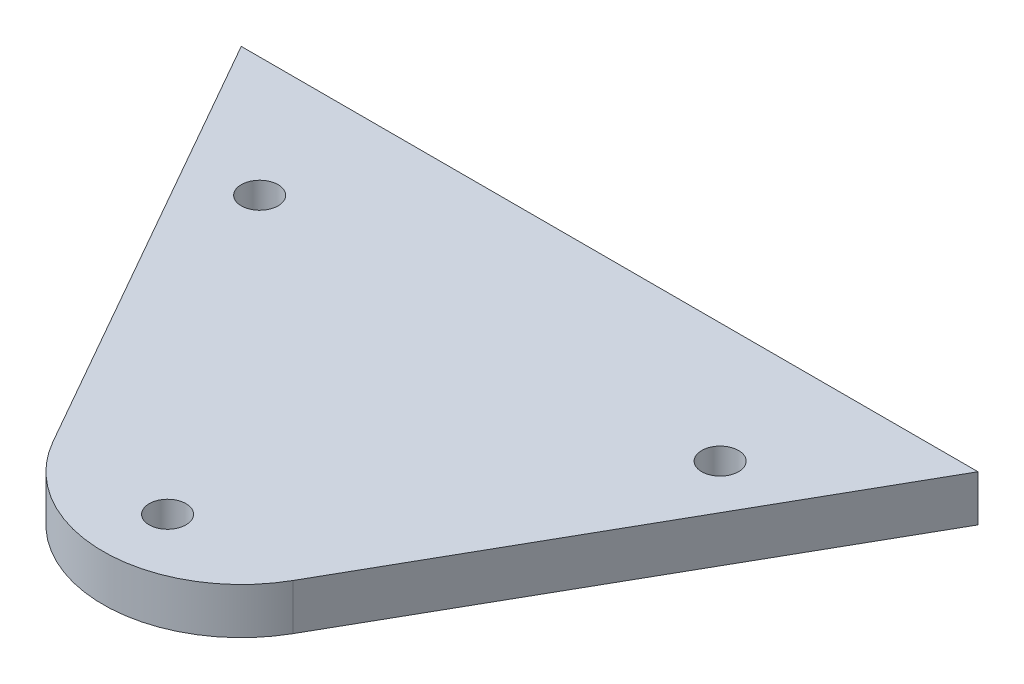
ISO-10303-21;
HEADER;
FILE_DESCRIPTION(('STEP AP214'),'2;1');
FILE_NAME('part.step','',(''),(''),'','','');
FILE_SCHEMA(('AUTOMOTIVE_DESIGN { 1 0 10303 214 1 1 1 1 }'));
ENDSEC;
DATA;
#1=APPLICATION_CONTEXT('core data for automotive mechanical design processes');
#2=APPLICATION_PROTOCOL_DEFINITION('international standard','automotive_design',2000,#1);
#3=PRODUCT_CONTEXT('',#1,'mechanical');
#4=PRODUCT('Part','Part','',(#3));
#5=PRODUCT_RELATED_PRODUCT_CATEGORY('part','',(#4));
#6=PRODUCT_DEFINITION_FORMATION('','',#4);
#7=PRODUCT_DEFINITION_CONTEXT('part definition',#1,'design');
#8=PRODUCT_DEFINITION('design','',#6,#7);
#9=PRODUCT_DEFINITION_SHAPE('','',#8);
#10=(LENGTH_UNIT() NAMED_UNIT(*) SI_UNIT(.MILLI.,.METRE.));
#11=(NAMED_UNIT(*) PLANE_ANGLE_UNIT() SI_UNIT($,.RADIAN.));
#12=(NAMED_UNIT(*) SI_UNIT($,.STERADIAN.) SOLID_ANGLE_UNIT());
#13=UNCERTAINTY_MEASURE_WITH_UNIT(LENGTH_MEASURE(1.E-05),#10,'distance_accuracy_value','');
#14=(GEOMETRIC_REPRESENTATION_CONTEXT(3) GLOBAL_UNCERTAINTY_ASSIGNED_CONTEXT((#13)) GLOBAL_UNIT_ASSIGNED_CONTEXT((#10,
#11,#12)) REPRESENTATION_CONTEXT('',''));
#15=CARTESIAN_POINT('',(0.,0.,0.));
#16=DIRECTION('',(0.,0.,1.));
#17=DIRECTION('',(1.,0.,0.));
#18=AXIS2_PLACEMENT_3D('',#15,#16,#17);
#19=CARTESIAN_POINT('',(-40.,5.,-48.));
#20=DIRECTION('',(0.869294507164732,0.,-0.494294507164732));
#21=DIRECTION('',(-0.494294507164732,0.,-0.869294507164732));
#22=AXIS2_PLACEMENT_3D('',#19,#20,#21);
#23=PLANE('',#22);
#24=DIRECTION('',(0.494294507164732,0.,0.869294507164732));
#25=VECTOR('',#24,1.);
#26=CARTESIAN_POINT('',(-40.,0.,-48.));
#27=LINE('',#26,#25);
#28=CARTESIAN_POINT('',(-40.,0.,-48.));
#29=VERTEX_POINT('',#28);
#30=CARTESIAN_POINT('',(-13.039417607471,0.,-0.585582392529021));
#31=VERTEX_POINT('',#30);
#32=EDGE_CURVE('E107',#29,#31,#27,.T.);
#33=ORIENTED_EDGE('',*,*,#32,.T.);
#34=DIRECTION('',(0.,-1.,0.));
#35=VECTOR('',#34,1.);
#36=CARTESIAN_POINT('',(-13.039417607471,5.,-0.585582392529021));
#37=LINE('',#36,#35);
#38=CARTESIAN_POINT('',(-13.039417607471,5.,-0.585582392529021));
#39=VERTEX_POINT('',#38);
#40=EDGE_CURVE('E11',#39,#31,#37,.T.);
#41=ORIENTED_EDGE('',*,*,#40,.F.);
#42=DIRECTION('',(0.494294507164732,0.,0.869294507164732));
#43=VECTOR('',#42,1.);
#44=CARTESIAN_POINT('',(-40.,5.,-48.));
#45=LINE('',#44,#43);
#46=CARTESIAN_POINT('',(-40.,5.,-48.));
#47=VERTEX_POINT('',#46);
#48=EDGE_CURVE('E91',#47,#39,#45,.T.);
#49=ORIENTED_EDGE('',*,*,#48,.F.);
#50=DIRECTION('',(0.,-1.,0.));
#51=VECTOR('',#50,1.);
#52=CARTESIAN_POINT('',(-40.,5.,-48.));
#53=LINE('',#52,#51);
#54=EDGE_CURVE('E103',#47,#29,#53,.T.);
#55=ORIENTED_EDGE('',*,*,#54,.T.);
#56=EDGE_LOOP('',(#33,#41,#49,#55));
#57=FACE_BOUND('',#56,.T.);
#58=ADVANCED_FACE('F39',(#57),#23,.F.);
#59=CARTESIAN_POINT('',(0.,5.,-8.));
#60=DIRECTION('',(0.,-1.,0.));
#61=DIRECTION('',(0.,0.,-1.));
#62=AXIS2_PLACEMENT_3D('',#59,#60,#61);
#63=CYLINDRICAL_SURFACE('',#62,15.);
#64=CARTESIAN_POINT('',(0.,0.,-8.));
#65=DIRECTION('',(0.,1.,0.));
#66=DIRECTION('',(0.,0.,1.));
#67=AXIS2_PLACEMENT_3D('',#64,#65,#66);
#68=CIRCLE('',#67,15.);
#69=CARTESIAN_POINT('',(13.039417607471,0.,-0.585582392529017));
#70=VERTEX_POINT('',#69);
#71=EDGE_CURVE('E96',#31,#70,#68,.T.);
#72=ORIENTED_EDGE('',*,*,#71,.T.);
#73=DIRECTION('',(0.,-1.,0.));
#74=VECTOR('',#73,1.);
#75=CARTESIAN_POINT('',(13.039417607471,5.,-0.585582392529017));
#76=LINE('',#75,#74);
#77=CARTESIAN_POINT('',(13.039417607471,5.,-0.585582392529017));
#78=VERTEX_POINT('',#77);
#79=EDGE_CURVE('E48',#78,#70,#76,.T.);
#80=ORIENTED_EDGE('',*,*,#79,.F.);
#81=CARTESIAN_POINT('',(0.,5.,-8.));
#82=DIRECTION('',(0.,1.,0.));
#83=DIRECTION('',(0.,0.,1.));
#84=AXIS2_PLACEMENT_3D('',#81,#82,#83);
#85=CIRCLE('',#84,15.);
#86=EDGE_CURVE('E86',#39,#78,#85,.T.);
#87=ORIENTED_EDGE('',*,*,#86,.F.);
#88=ORIENTED_EDGE('',*,*,#40,.T.);
#89=EDGE_LOOP('',(#72,#80,#87,#88));
#90=FACE_BOUND('',#89,.T.);
#91=ADVANCED_FACE('F95',(#90),#63,.T.);
#92=CARTESIAN_POINT('',(13.039417607471,5.,-0.585582392529017));
#93=DIRECTION('',(-0.869294507164732,0.,-0.494294507164732));
#94=DIRECTION('',(-0.494294507164732,0.,0.869294507164732));
#95=AXIS2_PLACEMENT_3D('',#92,#93,#94);
#96=PLANE('',#95);
#97=DIRECTION('',(0.494294507164732,0.,-0.869294507164732));
#98=VECTOR('',#97,1.);
#99=CARTESIAN_POINT('',(13.039417607471,0.,-0.585582392529017));
#100=LINE('',#99,#98);
#101=CARTESIAN_POINT('',(40.,0.,-48.));
#102=VERTEX_POINT('',#101);
#103=EDGE_CURVE('E73',#70,#102,#100,.T.);
#104=ORIENTED_EDGE('',*,*,#103,.T.);
#105=DIRECTION('',(0.,-1.,0.));
#106=VECTOR('',#105,1.);
#107=CARTESIAN_POINT('',(40.,5.,-48.));
#108=LINE('',#107,#106);
#109=CARTESIAN_POINT('',(40.,5.,-48.));
#110=VERTEX_POINT('',#109);
#111=EDGE_CURVE('E98',#110,#102,#108,.T.);
#112=ORIENTED_EDGE('',*,*,#111,.F.);
#113=DIRECTION('',(0.494294507164732,0.,-0.869294507164732));
#114=VECTOR('',#113,1.);
#115=CARTESIAN_POINT('',(13.039417607471,5.,-0.585582392529017));
#116=LINE('',#115,#114);
#117=EDGE_CURVE('E89',#78,#110,#116,.T.);
#118=ORIENTED_EDGE('',*,*,#117,.F.);
#119=ORIENTED_EDGE('',*,*,#79,.T.);
#120=EDGE_LOOP('',(#104,#112,#118,#119));
#121=FACE_BOUND('',#120,.T.);
#122=ADVANCED_FACE('F99',(#121),#96,.F.);
#123=CARTESIAN_POINT('',(40.,5.,-48.));
#124=DIRECTION('',(0.,0.,1.));
#125=DIRECTION('',(1.,0.,0.));
#126=AXIS2_PLACEMENT_3D('',#123,#124,#125);
#127=PLANE('',#126);
#128=DIRECTION('',(-1.,0.,0.));
#129=VECTOR('',#128,1.);
#130=CARTESIAN_POINT('',(40.,0.,-48.));
#131=LINE('',#130,#129);
#132=EDGE_CURVE('E79',#102,#29,#131,.T.);
#133=ORIENTED_EDGE('',*,*,#132,.T.);
#134=ORIENTED_EDGE('',*,*,#54,.F.);
#135=DIRECTION('',(-1.,0.,0.));
#136=VECTOR('',#135,1.);
#137=CARTESIAN_POINT('',(40.,5.,-48.));
#138=LINE('',#137,#136);
#139=EDGE_CURVE('E56',#110,#47,#138,.T.);
#140=ORIENTED_EDGE('',*,*,#139,.F.);
#141=ORIENTED_EDGE('',*,*,#111,.T.);
#142=EDGE_LOOP('',(#133,#134,#140,#141));
#143=FACE_BOUND('',#142,.T.);
#144=ADVANCED_FACE('F121',(#143),#127,.F.);
#145=CARTESIAN_POINT('',(0.,5.,-8.));
#146=DIRECTION('',(0.,1.,0.));
#147=DIRECTION('',(0.,0.,1.));
#148=AXIS2_PLACEMENT_3D('',#145,#146,#147);
#149=PLANE('',#148);
#150=CARTESIAN_POINT('',(0.,5.,0.));
#151=DIRECTION('',(0.,1.,0.));
#152=DIRECTION('',(0.,0.,1.));
#153=AXIS2_PLACEMENT_3D('',#150,#151,#152);
#154=CIRCLE('',#153,2.);
#155=CARTESIAN_POINT('',(0.,5.,2.));
#156=VERTEX_POINT('',#155);
#157=EDGE_CURVE('E147',#156,#156,#154,.T.);
#158=ORIENTED_EDGE('',*,*,#157,.F.);
#159=EDGE_LOOP('',(#158));
#160=FACE_BOUND('',#159,.T.);
#161=CARTESIAN_POINT('',(25.,5.,-35.));
#162=DIRECTION('',(0.,-1.,0.));
#163=DIRECTION('',(0.,0.,1.));
#164=AXIS2_PLACEMENT_3D('',#161,#162,#163);
#165=CIRCLE('',#164,2.);
#166=CARTESIAN_POINT('',(25.,5.,-33.));
#167=VERTEX_POINT('',#166);
#168=EDGE_CURVE('E135',#167,#167,#165,.T.);
#169=ORIENTED_EDGE('',*,*,#168,.T.);
#170=EDGE_LOOP('',(#169));
#171=FACE_BOUND('',#170,.T.);
#172=CARTESIAN_POINT('',(-25.,5.,-35.));
#173=DIRECTION('',(0.,1.,0.));
#174=DIRECTION('',(0.,0.,1.));
#175=AXIS2_PLACEMENT_3D('',#172,#173,#174);
#176=CIRCLE('',#175,2.);
#177=CARTESIAN_POINT('',(-25.,5.,-33.));
#178=VERTEX_POINT('',#177);
#179=EDGE_CURVE('E131',#178,#178,#176,.T.);
#180=ORIENTED_EDGE('',*,*,#179,.F.);
#181=EDGE_LOOP('',(#180));
#182=FACE_BOUND('',#181,.T.);
#183=ORIENTED_EDGE('',*,*,#48,.T.);
#184=ORIENTED_EDGE('',*,*,#86,.T.);
#185=ORIENTED_EDGE('',*,*,#117,.T.);
#186=ORIENTED_EDGE('',*,*,#139,.T.);
#187=EDGE_LOOP('',(#183,#184,#185,#186));
#188=FACE_BOUND('',#187,.T.);
#189=ADVANCED_FACE('F87',(#160,#171,#182,#188),#149,.T.);
#190=CARTESIAN_POINT('',(0.,0.,-8.));
#191=DIRECTION('',(0.,1.,0.));
#192=DIRECTION('',(0.,0.,1.));
#193=AXIS2_PLACEMENT_3D('',#190,#191,#192);
#194=PLANE('',#193);
#195=CARTESIAN_POINT('',(0.,0.,0.));
#196=DIRECTION('',(0.,1.,0.));
#197=DIRECTION('',(0.,0.,1.));
#198=AXIS2_PLACEMENT_3D('',#195,#196,#197);
#199=CIRCLE('',#198,2.);
#200=CARTESIAN_POINT('',(0.,0.,2.));
#201=VERTEX_POINT('',#200);
#202=EDGE_CURVE('E140',#201,#201,#199,.F.);
#203=ORIENTED_EDGE('',*,*,#202,.F.);
#204=EDGE_LOOP('',(#203));
#205=FACE_BOUND('',#204,.T.);
#206=CARTESIAN_POINT('',(25.,0.,-35.));
#207=DIRECTION('',(0.,1.,0.));
#208=DIRECTION('',(0.,0.,1.));
#209=AXIS2_PLACEMENT_3D('',#206,#207,#208);
#210=CIRCLE('',#209,2.);
#211=CARTESIAN_POINT('',(25.,0.,-33.));
#212=VERTEX_POINT('',#211);
#213=EDGE_CURVE('E136',#212,#212,#210,.T.);
#214=ORIENTED_EDGE('',*,*,#213,.T.);
#215=EDGE_LOOP('',(#214));
#216=FACE_BOUND('',#215,.T.);
#217=CARTESIAN_POINT('',(-25.,0.,-35.));
#218=DIRECTION('',(0.,1.,0.));
#219=DIRECTION('',(0.,0.,1.));
#220=AXIS2_PLACEMENT_3D('',#217,#218,#219);
#221=CIRCLE('',#220,2.);
#222=CARTESIAN_POINT('',(-25.,0.,-33.));
#223=VERTEX_POINT('',#222);
#224=EDGE_CURVE('E111',#223,#223,#221,.F.);
#225=ORIENTED_EDGE('',*,*,#224,.F.);
#226=EDGE_LOOP('',(#225));
#227=FACE_BOUND('',#226,.T.);
#228=ORIENTED_EDGE('',*,*,#32,.F.);
#229=ORIENTED_EDGE('',*,*,#132,.F.);
#230=ORIENTED_EDGE('',*,*,#103,.F.);
#231=ORIENTED_EDGE('',*,*,#71,.F.);
#232=EDGE_LOOP('',(#228,#229,#230,#231));
#233=FACE_BOUND('',#232,.T.);
#234=ADVANCED_FACE('F124',(#205,#216,#227,#233),#194,.F.);
#235=CARTESIAN_POINT('',(-25.,-0.00100000000000013,-35.));
#236=DIRECTION('',(0.,1.,0.));
#237=DIRECTION('',(0.,0.,1.));
#238=AXIS2_PLACEMENT_3D('',#235,#236,#237);
#239=CYLINDRICAL_SURFACE('',#238,2.);
#240=ORIENTED_EDGE('',*,*,#179,.T.);
#241=EDGE_LOOP('',(#240));
#242=FACE_BOUND('',#241,.T.);
#243=ORIENTED_EDGE('',*,*,#224,.T.);
#244=EDGE_LOOP('',(#243));
#245=FACE_BOUND('',#244,.T.);
#246=ADVANCED_FACE('F162',(#242,#245),#239,.F.);
#247=CARTESIAN_POINT('',(25.,-0.00100000000000013,-35.));
#248=DIRECTION('',(0.,1.,0.));
#249=DIRECTION('',(0.,0.,1.));
#250=AXIS2_PLACEMENT_3D('',#247,#248,#249);
#251=CYLINDRICAL_SURFACE('',#250,2.);
#252=ORIENTED_EDGE('',*,*,#168,.F.);
#253=EDGE_LOOP('',(#252));
#254=FACE_BOUND('',#253,.T.);
#255=ORIENTED_EDGE('',*,*,#213,.F.);
#256=EDGE_LOOP('',(#255));
#257=FACE_BOUND('',#256,.T.);
#258=ADVANCED_FACE('F165',(#254,#257),#251,.F.);
#259=CARTESIAN_POINT('',(0.,-0.00100000000000013,0.));
#260=DIRECTION('',(0.,1.,0.));
#261=DIRECTION('',(0.,0.,1.));
#262=AXIS2_PLACEMENT_3D('',#259,#260,#261);
#263=CYLINDRICAL_SURFACE('',#262,2.);
#264=ORIENTED_EDGE('',*,*,#157,.T.);
#265=EDGE_LOOP('',(#264));
#266=FACE_BOUND('',#265,.T.);
#267=ORIENTED_EDGE('',*,*,#202,.T.);
#268=EDGE_LOOP('',(#267));
#269=FACE_BOUND('',#268,.T.);
#270=ADVANCED_FACE('F152',(#266,#269),#263,.F.);
#271=CLOSED_SHELL('',(#58,#91,#122,#144,#189,#234,#246,#258,#270));
#272=MANIFOLD_SOLID_BREP('B2',#271);
#273=ADVANCED_BREP_SHAPE_REPRESENTATION('',(#18,#272),#14);
#274=SHAPE_DEFINITION_REPRESENTATION(#9,#273);
ENDSEC;
END-ISO-10303-21;
